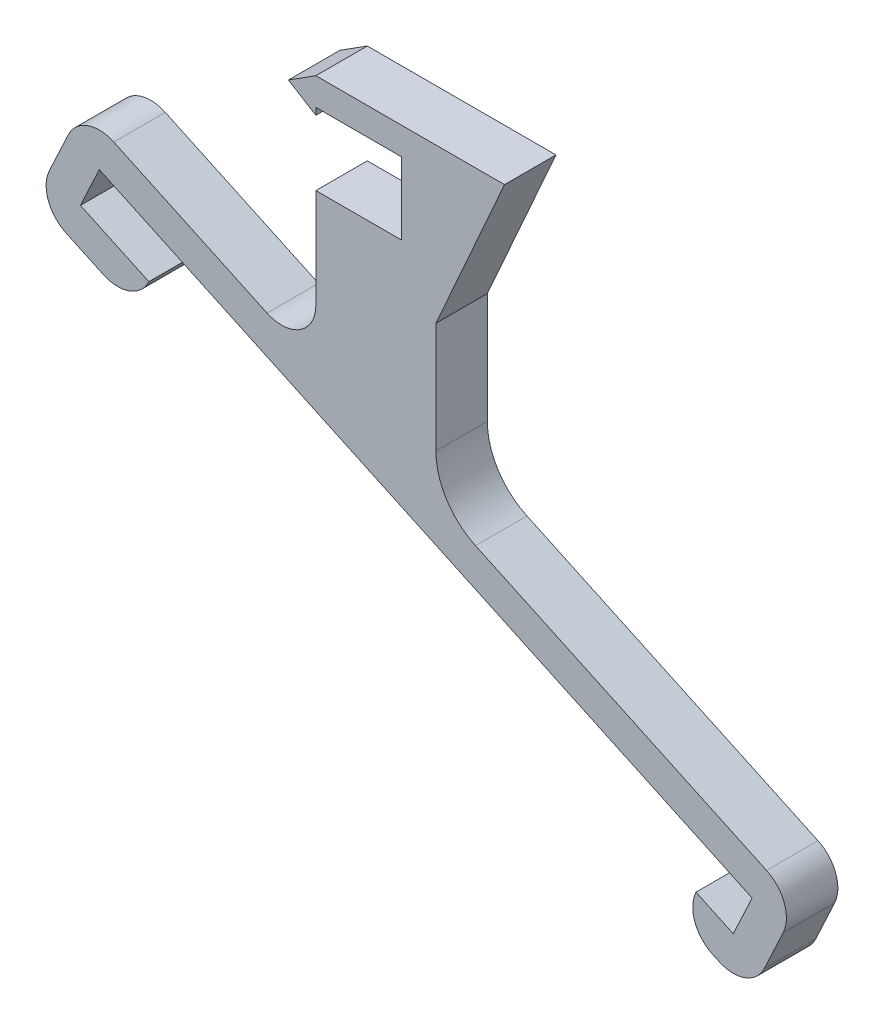
ISO-10303-21;
HEADER;
FILE_DESCRIPTION(('STEP AP214'),'2;1');
FILE_NAME('part.step','',(''),(''),'','','');
FILE_SCHEMA(('AUTOMOTIVE_DESIGN { 1 0 10303 214 1 1 1 1 }'));
ENDSEC;
DATA;
#1=APPLICATION_CONTEXT('core data for automotive mechanical design processes');
#2=APPLICATION_PROTOCOL_DEFINITION('international standard','automotive_design',2000,#1);
#3=PRODUCT_CONTEXT('',#1,'mechanical');
#4=PRODUCT('Part','Part','',(#3));
#5=PRODUCT_RELATED_PRODUCT_CATEGORY('part','',(#4));
#6=PRODUCT_DEFINITION_FORMATION('','',#4);
#7=PRODUCT_DEFINITION_CONTEXT('part definition',#1,'design');
#8=PRODUCT_DEFINITION('design','',#6,#7);
#9=PRODUCT_DEFINITION_SHAPE('','',#8);
#10=(LENGTH_UNIT() NAMED_UNIT(*) SI_UNIT(.MILLI.,.METRE.));
#11=(NAMED_UNIT(*) PLANE_ANGLE_UNIT() SI_UNIT($,.RADIAN.));
#12=(NAMED_UNIT(*) SI_UNIT($,.STERADIAN.) SOLID_ANGLE_UNIT());
#13=UNCERTAINTY_MEASURE_WITH_UNIT(LENGTH_MEASURE(1.E-05),#10,'distance_accuracy_value','');
#14=(GEOMETRIC_REPRESENTATION_CONTEXT(3) GLOBAL_UNCERTAINTY_ASSIGNED_CONTEXT((#13)) GLOBAL_UNIT_ASSIGNED_CONTEXT((#10,
#11,#12)) REPRESENTATION_CONTEXT('',''));
#15=CARTESIAN_POINT('',(0.,0.,0.));
#16=DIRECTION('',(0.,0.,1.));
#17=DIRECTION('',(1.,0.,0.));
#18=AXIS2_PLACEMENT_3D('',#15,#16,#17);
#19=CARTESIAN_POINT('',(0.,-21.,15.));
#20=DIRECTION('',(1.,0.,0.));
#21=DIRECTION('',(0.,0.,-1.));
#22=AXIS2_PLACEMENT_3D('',#19,#20,#21);
#23=PLANE('',#22);
#24=DIRECTION('',(0.,-1.,0.));
#25=VECTOR('',#24,1.);
#26=CARTESIAN_POINT('',(0.,-21.,0.));
#27=LINE('',#26,#25);
#28=CARTESIAN_POINT('',(0.,0.,0.));
#29=VERTEX_POINT('',#28);
#30=CARTESIAN_POINT('',(0.,-21.,0.));
#31=VERTEX_POINT('',#30);
#32=EDGE_CURVE('E253',#29,#31,#27,.T.);
#33=ORIENTED_EDGE('',*,*,#32,.T.);
#34=DIRECTION('',(0.,0.,-1.));
#35=VECTOR('',#34,1.);
#36=CARTESIAN_POINT('',(0.,-21.,15.));
#37=LINE('',#36,#35);
#38=CARTESIAN_POINT('',(0.,-21.,15.));
#39=VERTEX_POINT('',#38);
#40=EDGE_CURVE('E232',#39,#31,#37,.T.);
#41=ORIENTED_EDGE('',*,*,#40,.F.);
#42=DIRECTION('',(0.,-1.,0.));
#43=VECTOR('',#42,1.);
#44=CARTESIAN_POINT('',(0.,-21.,15.));
#45=LINE('',#44,#43);
#46=CARTESIAN_POINT('',(0.,0.,15.));
#47=VERTEX_POINT('',#46);
#48=EDGE_CURVE('E240',#47,#39,#45,.T.);
#49=ORIENTED_EDGE('',*,*,#48,.F.);
#50=DIRECTION('',(0.,0.,-1.));
#51=VECTOR('',#50,1.);
#52=CARTESIAN_POINT('',(0.,0.,15.));
#53=LINE('',#52,#51);
#54=EDGE_CURVE('E350',#47,#29,#53,.T.);
#55=ORIENTED_EDGE('',*,*,#54,.T.);
#56=EDGE_LOOP('',(#33,#41,#49,#55));
#57=FACE_BOUND('',#56,.T.);
#58=ADVANCED_FACE('F37',(#57),#23,.F.);
#59=CARTESIAN_POINT('',(-25.,-21.,15.));
#60=DIRECTION('',(0.,-1.,0.));
#61=DIRECTION('',(0.,0.,-1.));
#62=AXIS2_PLACEMENT_3D('',#59,#60,#61);
#63=PLANE('',#62);
#64=DIRECTION('',(-1.,0.,0.));
#65=VECTOR('',#64,1.);
#66=CARTESIAN_POINT('',(-25.,-21.,0.));
#67=LINE('',#66,#65);
#68=CARTESIAN_POINT('',(-25.,-21.,0.));
#69=VERTEX_POINT('',#68);
#70=EDGE_CURVE('E447',#31,#69,#67,.T.);
#71=ORIENTED_EDGE('',*,*,#70,.T.);
#72=DIRECTION('',(0.,0.,-1.));
#73=VECTOR('',#72,1.);
#74=CARTESIAN_POINT('',(-25.,-21.,15.));
#75=LINE('',#74,#73);
#76=CARTESIAN_POINT('',(-25.,-21.,15.));
#77=VERTEX_POINT('',#76);
#78=EDGE_CURVE('E235',#77,#69,#75,.T.);
#79=ORIENTED_EDGE('',*,*,#78,.F.);
#80=DIRECTION('',(-1.,0.,0.));
#81=VECTOR('',#80,1.);
#82=CARTESIAN_POINT('',(-25.,-21.,15.));
#83=LINE('',#82,#81);
#84=EDGE_CURVE('E228',#39,#77,#83,.T.);
#85=ORIENTED_EDGE('',*,*,#84,.F.);
#86=ORIENTED_EDGE('',*,*,#40,.T.);
#87=EDGE_LOOP('',(#71,#79,#85,#86));
#88=FACE_BOUND('',#87,.T.);
#89=ADVANCED_FACE('F230',(#88),#63,.F.);
#90=CARTESIAN_POINT('',(-25.,-65.6792319645748,15.));
#91=DIRECTION('',(1.,0.,0.));
#92=DIRECTION('',(0.,0.,-1.));
#93=AXIS2_PLACEMENT_3D('',#90,#91,#92);
#94=PLANE('',#93);
#95=DIRECTION('',(0.,-1.,0.));
#96=VECTOR('',#95,1.);
#97=CARTESIAN_POINT('',(-25.,-65.6792319645748,0.));
#98=LINE('',#97,#96);
#99=CARTESIAN_POINT('',(-25.,-49.9823761933999,0.));
#100=VERTEX_POINT('',#99);
#101=EDGE_CURVE('E449',#69,#100,#98,.T.);
#102=ORIENTED_EDGE('',*,*,#101,.T.);
#103=DIRECTION('',(0.,0.,-1.));
#104=VECTOR('',#103,1.);
#105=CARTESIAN_POINT('',(-25.,-49.9823761933999,15.));
#106=LINE('',#105,#104);
#107=CARTESIAN_POINT('',(-25.,-49.9823761933999,15.));
#108=VERTEX_POINT('',#107);
#109=EDGE_CURVE('E311',#100,#108,#106,.F.);
#110=ORIENTED_EDGE('',*,*,#109,.T.);
#111=DIRECTION('',(0.,-1.,0.));
#112=VECTOR('',#111,1.);
#113=CARTESIAN_POINT('',(-25.,-65.6792319645748,15.));
#114=LINE('',#113,#112);
#115=EDGE_CURVE('E239',#77,#108,#114,.T.);
#116=ORIENTED_EDGE('',*,*,#115,.F.);
#117=ORIENTED_EDGE('',*,*,#78,.T.);
#118=EDGE_LOOP('',(#102,#110,#116,#117));
#119=FACE_BOUND('',#118,.T.);
#120=ADVANCED_FACE('F532',(#119),#94,.F.);
#121=CARTESIAN_POINT('',(-92.9730840277486,-33.9828623340221,15.));
#122=DIRECTION('',(-0.422618261740704,-0.906307787036648,0.));
#123=DIRECTION('',(0.906307787036648,-0.422618261740704,0.));
#124=AXIS2_PLACEMENT_3D('',#121,#122,#123);
#125=PLANE('',#124);
#126=DIRECTION('',(-0.906307787036648,0.422618261740704,0.));
#127=VECTOR('',#126,1.);
#128=CARTESIAN_POINT('',(-92.9730840277486,-33.9828623340221,0.));
#129=LINE('',#128,#127);
#130=CARTESIAN_POINT('',(-39.226182617407,-59.0454540637663,0.));
#131=VERTEX_POINT('',#130);
#132=CARTESIAN_POINT('',(-83.9100061573821,-38.2090449514291,0.));
#133=VERTEX_POINT('',#132);
#134=EDGE_CURVE('E452',#131,#133,#129,.T.);
#135=ORIENTED_EDGE('',*,*,#134,.T.);
#136=DIRECTION('',(0.,0.,-1.));
#137=VECTOR('',#136,1.);
#138=CARTESIAN_POINT('',(-83.9100061573821,-38.2090449514291,15.));
#139=LINE('',#138,#137);
#140=CARTESIAN_POINT('',(-83.9100061573821,-38.2090449514291,15.));
#141=VERTEX_POINT('',#140);
#142=EDGE_CURVE('E309',#133,#141,#139,.F.);
#143=ORIENTED_EDGE('',*,*,#142,.T.);
#144=DIRECTION('',(-0.906307787036648,0.422618261740704,0.));
#145=VECTOR('',#144,1.);
#146=CARTESIAN_POINT('',(-92.9730840277486,-33.9828623340221,15.));
#147=LINE('',#146,#145);
#148=CARTESIAN_POINT('',(-39.226182617407,-59.0454540637663,15.));
#149=VERTEX_POINT('',#148);
#150=EDGE_CURVE('E476',#149,#141,#147,.T.);
#151=ORIENTED_EDGE('',*,*,#150,.F.);
#152=DIRECTION('',(0.,0.,-1.));
#153=VECTOR('',#152,1.);
#154=CARTESIAN_POINT('',(-39.226182617407,-59.0454540637663,0.));
#155=LINE('',#154,#153);
#156=EDGE_CURVE('E306',#149,#131,#155,.T.);
#157=ORIENTED_EDGE('',*,*,#156,.T.);
#158=EDGE_LOOP('',(#135,#143,#151,#157));
#159=FACE_BOUND('',#158,.T.);
#160=ADVANCED_FACE('F776',(#159),#125,.F.);
#161=CARTESIAN_POINT('',(-106.919486665192,-63.8910193062314,15.));
#162=DIRECTION('',(0.906307787036648,-0.422618261740703,0.));
#163=DIRECTION('',(0.422618261740703,0.906307787036648,0.));
#164=AXIS2_PLACEMENT_3D('',#161,#162,#163);
#165=PLANE('',#164);
#166=DIRECTION('',(-0.422618261740703,-0.906307787036648,0.));
#167=VECTOR('',#166,1.);
#168=CARTESIAN_POINT('',(-106.919486665192,-63.8910193062314,0.));
#169=LINE('',#168,#167);
#170=CARTESIAN_POINT('',(-97.1992666451556,-43.0459402043885,0.));
#171=VERTEX_POINT('',#170);
#172=CARTESIAN_POINT('',(-102.693304047785,-54.8279414358649,0.));
#173=VERTEX_POINT('',#172);
#174=EDGE_CURVE('E403',#171,#173,#169,.T.);
#175=ORIENTED_EDGE('',*,*,#174,.T.);
#176=DIRECTION('',(0.,0.,-1.));
#177=VECTOR('',#176,1.);
#178=CARTESIAN_POINT('',(-102.693304047785,-54.8279414358649,15.));
#179=LINE('',#178,#177);
#180=CARTESIAN_POINT('',(-102.693304047785,-54.8279414358649,15.));
#181=VERTEX_POINT('',#180);
#182=EDGE_CURVE('E304',#173,#181,#179,.F.);
#183=ORIENTED_EDGE('',*,*,#182,.T.);
#184=DIRECTION('',(-0.422618261740703,-0.906307787036648,0.));
#185=VECTOR('',#184,1.);
#186=CARTESIAN_POINT('',(-106.919486665192,-63.8910193062314,15.));
#187=LINE('',#186,#185);
#188=CARTESIAN_POINT('',(-97.1992666451556,-43.0459402043885,15.));
#189=VERTEX_POINT('',#188);
#190=EDGE_CURVE('E469',#189,#181,#187,.T.);
#191=ORIENTED_EDGE('',*,*,#190,.F.);
#192=DIRECTION('',(0.,0.,-1.));
#193=VECTOR('',#192,1.);
#194=CARTESIAN_POINT('',(-97.1992666451556,-43.0459402043885,15.));
#195=LINE('',#194,#193);
#196=EDGE_CURVE('E301',#189,#171,#195,.T.);
#197=ORIENTED_EDGE('',*,*,#196,.T.);
#198=EDGE_LOOP('',(#175,#183,#191,#197));
#199=FACE_BOUND('',#198,.T.);
#200=ADVANCED_FACE('F458',(#199),#165,.F.);
#201=CARTESIAN_POINT('',(-77.9176374800191,-77.4148036819339,15.));
#202=DIRECTION('',(0.422618261740703,0.906307787036648,0.));
#203=DIRECTION('',(-0.906307787036648,0.422618261740703,0.));
#204=AXIS2_PLACEMENT_3D('',#201,#202,#203);
#205=PLANE('',#204);
#206=DIRECTION('',(0.906307787036648,-0.422618261740703,0.));
#207=VECTOR('',#206,1.);
#208=CARTESIAN_POINT('',(-77.9176374800191,-77.4148036819339,0.));
#209=LINE('',#208,#207);
#210=CARTESIAN_POINT('',(-97.8564087948253,-68.1172019236385,0.));
#211=VERTEX_POINT('',#210);
#212=CARTESIAN_POINT('',(-86.9807153503855,-73.1886210645269,0.));
#213=VERTEX_POINT('',#212);
#214=EDGE_CURVE('E399',#211,#213,#209,.T.);
#215=ORIENTED_EDGE('',*,*,#214,.T.);
#216=DIRECTION('',(0.,0.,-1.));
#217=VECTOR('',#216,1.);
#218=CARTESIAN_POINT('',(-86.9807153503855,-73.1886210645269,15.));
#219=LINE('',#218,#217);
#220=CARTESIAN_POINT('',(-86.9807153503855,-73.1886210645269,15.));
#221=VERTEX_POINT('',#220);
#222=EDGE_CURVE('E299',#213,#221,#219,.F.);
#223=ORIENTED_EDGE('',*,*,#222,.T.);
#224=DIRECTION('',(0.906307787036648,-0.422618261740703,0.));
#225=VECTOR('',#224,1.);
#226=CARTESIAN_POINT('',(-77.9176374800191,-77.4148036819339,15.));
#227=LINE('',#226,#225);
#228=CARTESIAN_POINT('',(-97.8564087948253,-68.1172019236385,15.));
#229=VERTEX_POINT('',#228);
#230=EDGE_CURVE('E468',#229,#221,#227,.T.);
#231=ORIENTED_EDGE('',*,*,#230,.F.);
#232=DIRECTION('',(0.,0.,-1.));
#233=VECTOR('',#232,1.);
#234=CARTESIAN_POINT('',(-97.8564087948253,-68.1172019236385,15.));
#235=LINE('',#234,#233);
#236=EDGE_CURVE('E296',#229,#211,#235,.T.);
#237=ORIENTED_EDGE('',*,*,#236,.T.);
#238=EDGE_LOOP('',(#215,#223,#231,#237));
#239=FACE_BOUND('',#238,.T.);
#240=ADVANCED_FACE('F471',(#239),#205,.F.);
#241=CARTESIAN_POINT('',(-93.6302261774183,-59.0541240532721,15.));
#242=DIRECTION('',(-0.422618261740703,-0.906307787036648,0.));
#243=DIRECTION('',(0.906307787036648,-0.422618261740703,0.));
#244=AXIS2_PLACEMENT_3D('',#241,#242,#243);
#245=PLANE('',#244);
#246=DIRECTION('',(-0.906307787036648,0.422618261740703,0.));
#247=VECTOR('',#246,1.);
#248=CARTESIAN_POINT('',(-93.6302261774183,-59.0541240532721,0.));
#249=LINE('',#248,#247);
#250=CARTESIAN_POINT('',(-73.691454862612,-68.3517258115675,0.));
#251=VERTEX_POINT('',#250);
#252=CARTESIAN_POINT('',(-93.6302261774183,-59.0541240532721,0.));
#253=VERTEX_POINT('',#252);
#254=EDGE_CURVE('E390',#251,#253,#249,.T.);
#255=ORIENTED_EDGE('',*,*,#254,.T.);
#256=DIRECTION('',(0.,0.,-1.));
#257=VECTOR('',#256,1.);
#258=CARTESIAN_POINT('',(-93.6302261774183,-59.0541240532721,15.));
#259=LINE('',#258,#257);
#260=CARTESIAN_POINT('',(-93.6302261774183,-59.0541240532721,15.));
#261=VERTEX_POINT('',#260);
#262=EDGE_CURVE('E381',#261,#253,#259,.T.);
#263=ORIENTED_EDGE('',*,*,#262,.F.);
#264=DIRECTION('',(-0.906307787036648,0.422618261740703,0.));
#265=VECTOR('',#264,1.);
#266=CARTESIAN_POINT('',(-93.6302261774183,-59.0541240532721,15.));
#267=LINE('',#266,#265);
#268=CARTESIAN_POINT('',(-73.691454862612,-68.3517258115675,15.));
#269=VERTEX_POINT('',#268);
#270=EDGE_CURVE('E391',#269,#261,#267,.T.);
#271=ORIENTED_EDGE('',*,*,#270,.F.);
#272=DIRECTION('',(0.,0.,-1.));
#273=VECTOR('',#272,1.);
#274=CARTESIAN_POINT('',(-73.691454862612,-68.3517258115675,15.));
#275=LINE('',#274,#273);
#276=EDGE_CURVE('E259',#269,#251,#275,.T.);
#277=ORIENTED_EDGE('',*,*,#276,.T.);
#278=EDGE_LOOP('',(#255,#263,#271,#277));
#279=FACE_BOUND('',#278,.T.);
#280=ADVANCED_FACE('F388',(#279),#245,.F.);
#281=CARTESIAN_POINT('',(-88.1361887747892,-47.2721228217957,15.));
#282=DIRECTION('',(-0.906307787036648,0.422618261740705,0.));
#283=DIRECTION('',(-0.422618261740705,-0.906307787036648,0.));
#284=AXIS2_PLACEMENT_3D('',#281,#282,#283);
#285=PLANE('',#284);
#286=DIRECTION('',(0.422618261740705,0.906307787036647,0.));
#287=VECTOR('',#286,1.);
#288=CARTESIAN_POINT('',(-88.1361887747892,-47.2721228217957,0.));
#289=LINE('',#288,#287);
#290=CARTESIAN_POINT('',(-88.1361887747892,-47.2721228217957,0.));
#291=VERTEX_POINT('',#290);
#292=EDGE_CURVE('E398',#253,#291,#289,.T.);
#293=ORIENTED_EDGE('',*,*,#292,.T.);
#294=DIRECTION('',(0.,0.,-1.));
#295=VECTOR('',#294,1.);
#296=CARTESIAN_POINT('',(-88.1361887747892,-47.2721228217957,15.));
#297=LINE('',#296,#295);
#298=CARTESIAN_POINT('',(-88.1361887747892,-47.2721228217957,15.));
#299=VERTEX_POINT('',#298);
#300=EDGE_CURVE('E378',#299,#291,#297,.T.);
#301=ORIENTED_EDGE('',*,*,#300,.F.);
#302=DIRECTION('',(0.422618261740705,0.906307787036647,0.));
#303=VECTOR('',#302,1.);
#304=CARTESIAN_POINT('',(-88.1361887747892,-47.2721228217957,15.));
#305=LINE('',#304,#303);
#306=EDGE_CURVE('E474',#261,#299,#305,.T.);
#307=ORIENTED_EDGE('',*,*,#306,.F.);
#308=ORIENTED_EDGE('',*,*,#262,.T.);
#309=EDGE_LOOP('',(#293,#301,#307,#308));
#310=FACE_BOUND('',#309,.T.);
#311=ADVANCED_FACE('F516',(#310),#285,.F.);
#312=CARTESIAN_POINT('',(102.188446502907,-136.021957787343,15.));
#313=DIRECTION('',(0.422618261740703,0.906307787036648,0.));
#314=DIRECTION('',(-0.906307787036648,0.422618261740703,0.));
#315=AXIS2_PLACEMENT_3D('',#312,#313,#314);
#316=PLANE('',#315);
#317=DIRECTION('',(0.906307787036648,-0.422618261740703,0.));
#318=VECTOR('',#317,1.);
#319=CARTESIAN_POINT('',(102.188446502907,-136.021957787343,0.));
#320=LINE('',#319,#318);
#321=CARTESIAN_POINT('',(102.188446502907,-136.021957787343,0.));
#322=VERTEX_POINT('',#321);
#323=EDGE_CURVE('E401',#291,#322,#320,.T.);
#324=ORIENTED_EDGE('',*,*,#323,.T.);
#325=DIRECTION('',(0.,0.,-1.));
#326=VECTOR('',#325,1.);
#327=CARTESIAN_POINT('',(102.188446502907,-136.021957787343,15.));
#328=LINE('',#327,#326);
#329=CARTESIAN_POINT('',(102.188446502907,-136.021957787343,15.));
#330=VERTEX_POINT('',#329);
#331=EDGE_CURVE('E375',#330,#322,#328,.T.);
#332=ORIENTED_EDGE('',*,*,#331,.F.);
#333=DIRECTION('',(0.906307787036648,-0.422618261740703,0.));
#334=VECTOR('',#333,1.);
#335=CARTESIAN_POINT('',(102.188446502907,-136.021957787343,15.));
#336=LINE('',#335,#334);
#337=EDGE_CURVE('E481',#299,#330,#336,.T.);
#338=ORIENTED_EDGE('',*,*,#337,.F.);
#339=ORIENTED_EDGE('',*,*,#300,.T.);
#340=EDGE_LOOP('',(#324,#332,#338,#339));
#341=FACE_BOUND('',#340,.T.);
#342=ADVANCED_FACE('F511',(#341),#316,.F.);
#343=CARTESIAN_POINT('',(96.6944091002778,-147.80395901882,15.));
#344=DIRECTION('',(0.906307787036648,-0.422618261740704,0.));
#345=DIRECTION('',(0.422618261740704,0.906307787036648,0.));
#346=AXIS2_PLACEMENT_3D('',#343,#344,#345);
#347=PLANE('',#346);
#348=DIRECTION('',(-0.422618261740704,-0.906307787036648,0.));
#349=VECTOR('',#348,1.);
#350=CARTESIAN_POINT('',(96.6944091002778,-147.80395901882,0.));
#351=LINE('',#350,#349);
#352=CARTESIAN_POINT('',(96.6944091002778,-147.80395901882,0.));
#353=VERTEX_POINT('',#352);
#354=EDGE_CURVE('E408',#322,#353,#351,.T.);
#355=ORIENTED_EDGE('',*,*,#354,.T.);
#356=DIRECTION('',(0.,0.,-1.));
#357=VECTOR('',#356,1.);
#358=CARTESIAN_POINT('',(96.6944091002778,-147.80395901882,15.));
#359=LINE('',#358,#357);
#360=CARTESIAN_POINT('',(96.6944091002778,-147.80395901882,15.));
#361=VERTEX_POINT('',#360);
#362=EDGE_CURVE('E372',#361,#353,#359,.T.);
#363=ORIENTED_EDGE('',*,*,#362,.F.);
#364=DIRECTION('',(-0.422618261740704,-0.906307787036648,0.));
#365=VECTOR('',#364,1.);
#366=CARTESIAN_POINT('',(96.6944091002778,-147.80395901882,15.));
#367=LINE('',#366,#365);
#368=EDGE_CURVE('E483',#330,#361,#367,.T.);
#369=ORIENTED_EDGE('',*,*,#368,.F.);
#370=ORIENTED_EDGE('',*,*,#331,.T.);
#371=EDGE_LOOP('',(#355,#363,#369,#370));
#372=FACE_BOUND('',#371,.T.);
#373=ADVANCED_FACE('F508',(#372),#347,.F.);
#374=CARTESIAN_POINT('',(85.8187156558381,-142.732539877931,15.));
#375=DIRECTION('',(-0.422618261740719,-0.906307787036641,0.));
#376=DIRECTION('',(0.906307787036641,-0.422618261740719,0.));
#377=AXIS2_PLACEMENT_3D('',#374,#375,#376);
#378=PLANE('',#377);
#379=DIRECTION('',(-0.906307787036641,0.422618261740719,0.));
#380=VECTOR('',#379,1.);
#381=CARTESIAN_POINT('',(85.8187156558381,-142.732539877931,0.));
#382=LINE('',#381,#380);
#383=CARTESIAN_POINT('',(85.8187156558381,-142.732539877931,0.));
#384=VERTEX_POINT('',#383);
#385=EDGE_CURVE('E410',#353,#384,#382,.T.);
#386=ORIENTED_EDGE('',*,*,#385,.T.);
#387=DIRECTION('',(0.,0.,-1.));
#388=VECTOR('',#387,1.);
#389=CARTESIAN_POINT('',(85.8187156558381,-142.732539877931,15.));
#390=LINE('',#389,#388);
#391=CARTESIAN_POINT('',(85.8187156558381,-142.732539877931,15.));
#392=VERTEX_POINT('',#391);
#393=EDGE_CURVE('E369',#392,#384,#390,.T.);
#394=ORIENTED_EDGE('',*,*,#393,.F.);
#395=DIRECTION('',(-0.906307787036641,0.422618261740719,0.));
#396=VECTOR('',#395,1.);
#397=CARTESIAN_POINT('',(85.8187156558381,-142.732539877931,15.));
#398=LINE('',#397,#396);
#399=EDGE_CURVE('E485',#361,#392,#398,.T.);
#400=ORIENTED_EDGE('',*,*,#399,.F.);
#401=ORIENTED_EDGE('',*,*,#362,.T.);
#402=EDGE_LOOP('',(#386,#394,#400,#401));
#403=FACE_BOUND('',#402,.T.);
#404=ADVANCED_FACE('F503',(#403),#378,.F.);
#405=CARTESIAN_POINT('',(101.531304353237,-161.093219506593,15.));
#406=DIRECTION('',(0.422618261740702,0.906307787036649,0.));
#407=DIRECTION('',(-0.906307787036649,0.422618261740702,0.));
#408=AXIS2_PLACEMENT_3D('',#405,#406,#407);
#409=PLANE('',#408);
#410=DIRECTION('',(0.906307787036649,-0.422618261740702,0.));
#411=VECTOR('',#410,1.);
#412=CARTESIAN_POINT('',(101.531304353237,-161.093219506593,0.));
#413=LINE('',#412,#411);
#414=CARTESIAN_POINT('',(90.6556109087975,-156.021800365705,0.));
#415=VERTEX_POINT('',#414);
#416=CARTESIAN_POINT('',(92.4682264828708,-156.867036889186,0.));
#417=VERTEX_POINT('',#416);
#418=EDGE_CURVE('E413',#415,#417,#413,.T.);
#419=ORIENTED_EDGE('',*,*,#418,.T.);
#420=DIRECTION('',(0.,0.,-1.));
#421=VECTOR('',#420,1.);
#422=CARTESIAN_POINT('',(92.4682264828708,-156.867036889186,15.));
#423=LINE('',#422,#421);
#424=CARTESIAN_POINT('',(92.4682264828708,-156.867036889186,15.));
#425=VERTEX_POINT('',#424);
#426=EDGE_CURVE('E294',#417,#425,#423,.F.);
#427=ORIENTED_EDGE('',*,*,#426,.T.);
#428=DIRECTION('',(0.906307787036649,-0.422618261740702,0.));
#429=VECTOR('',#428,1.);
#430=CARTESIAN_POINT('',(101.531304353237,-161.093219506593,15.));
#431=LINE('',#430,#429);
#432=CARTESIAN_POINT('',(90.6556109087975,-156.021800365705,15.));
#433=VERTEX_POINT('',#432);
#434=EDGE_CURVE('E432',#433,#425,#431,.T.);
#435=ORIENTED_EDGE('',*,*,#434,.F.);
#436=DIRECTION('',(0.,0.,-1.));
#437=VECTOR('',#436,1.);
#438=CARTESIAN_POINT('',(90.6556109087975,-156.021800365705,15.));
#439=LINE('',#438,#437);
#440=EDGE_CURVE('E291',#433,#415,#439,.T.);
#441=ORIENTED_EDGE('',*,*,#440,.T.);
#442=EDGE_LOOP('',(#419,#427,#435,#441));
#443=FACE_BOUND('',#442,.T.);
#444=ADVANCED_FACE('F496',(#443),#409,.F.);
#445=CARTESIAN_POINT('',(115.47770699068,-131.185062534384,15.));
#446=DIRECTION('',(-0.906307787036648,0.422618261740703,0.));
#447=DIRECTION('',(-0.422618261740703,-0.906307787036648,0.));
#448=AXIS2_PLACEMENT_3D('',#445,#446,#447);
#449=PLANE('',#448);
#450=DIRECTION('',(0.422618261740703,0.906307787036648,0.));
#451=VECTOR('',#450,1.);
#452=CARTESIAN_POINT('',(115.47770699068,-131.185062534384,0.));
#453=LINE('',#452,#451);
#454=CARTESIAN_POINT('',(105.757486970644,-152.030141636227,0.));
#455=VERTEX_POINT('',#454);
#456=CARTESIAN_POINT('',(111.251524373273,-140.24814040475,0.));
#457=VERTEX_POINT('',#456);
#458=EDGE_CURVE('E338',#455,#457,#453,.T.);
#459=ORIENTED_EDGE('',*,*,#458,.T.);
#460=DIRECTION('',(0.,0.,-1.));
#461=VECTOR('',#460,1.);
#462=CARTESIAN_POINT('',(111.251524373273,-140.24814040475,15.));
#463=LINE('',#462,#461);
#464=CARTESIAN_POINT('',(111.251524373273,-140.24814040475,15.));
#465=VERTEX_POINT('',#464);
#466=EDGE_CURVE('E277',#457,#465,#463,.F.);
#467=ORIENTED_EDGE('',*,*,#466,.T.);
#468=DIRECTION('',(0.422618261740703,0.906307787036648,0.));
#469=VECTOR('',#468,1.);
#470=CARTESIAN_POINT('',(115.47770699068,-131.185062534384,15.));
#471=LINE('',#470,#469);
#472=CARTESIAN_POINT('',(105.757486970644,-152.030141636227,15.));
#473=VERTEX_POINT('',#472);
#474=EDGE_CURVE('E427',#473,#465,#471,.T.);
#475=ORIENTED_EDGE('',*,*,#474,.F.);
#476=DIRECTION('',(0.,0.,-1.));
#477=VECTOR('',#476,1.);
#478=CARTESIAN_POINT('',(105.757486970644,-152.030141636227,15.));
#479=LINE('',#478,#477);
#480=EDGE_CURVE('E274',#473,#455,#479,.T.);
#481=ORIENTED_EDGE('',*,*,#480,.T.);
#482=EDGE_LOOP('',(#459,#467,#475,#481));
#483=FACE_BOUND('',#482,.T.);
#484=ADVANCED_FACE('F419',(#483),#449,.F.);
#485=CARTESIAN_POINT('',(10.,-82.,15.));
#486=DIRECTION('',(-0.422618261740704,-0.906307787036648,0.));
#487=DIRECTION('',(0.906307787036648,-0.422618261740704,0.));
#488=AXIS2_PLACEMENT_3D('',#485,#486,#487);
#489=PLANE('',#488);
#490=DIRECTION('',(-0.906307787036648,0.422618261740704,0.));
#491=VECTOR('',#490,1.);
#492=CARTESIAN_POINT('',(10.,-82.,0.));
#493=LINE('',#492,#491);
#494=CARTESIAN_POINT('',(106.414629120314,-126.958879916977,0.));
#495=VERTEX_POINT('',#494);
#496=CARTESIAN_POINT('',(21.5476347651859,-87.3847505245832,0.));
#497=VERTEX_POINT('',#496);
#498=EDGE_CURVE('E334',#495,#497,#493,.T.);
#499=ORIENTED_EDGE('',*,*,#498,.T.);
#500=DIRECTION('',(0.,0.,-1.));
#501=VECTOR('',#500,1.);
#502=CARTESIAN_POINT('',(21.5476347651859,-87.3847505245832,15.));
#503=LINE('',#502,#501);
#504=CARTESIAN_POINT('',(21.5476347651859,-87.3847505245832,15.));
#505=VERTEX_POINT('',#504);
#506=EDGE_CURVE('E58',#497,#505,#503,.F.);
#507=ORIENTED_EDGE('',*,*,#506,.T.);
#508=DIRECTION('',(-0.906307787036648,0.422618261740704,0.));
#509=VECTOR('',#508,1.);
#510=CARTESIAN_POINT('',(10.,-82.,15.));
#511=LINE('',#510,#509);
#512=CARTESIAN_POINT('',(106.414629120314,-126.958879916977,15.));
#513=VERTEX_POINT('',#512);
#514=EDGE_CURVE('E426',#513,#505,#511,.T.);
#515=ORIENTED_EDGE('',*,*,#514,.F.);
#516=DIRECTION('',(0.,0.,-1.));
#517=VECTOR('',#516,1.);
#518=CARTESIAN_POINT('',(106.414629120314,-126.958879916977,15.));
#519=LINE('',#518,#517);
#520=EDGE_CURVE('E254',#513,#495,#519,.T.);
#521=ORIENTED_EDGE('',*,*,#520,.T.);
#522=EDGE_LOOP('',(#499,#507,#515,#521));
#523=FACE_BOUND('',#522,.T.);
#524=ADVANCED_FACE('F428',(#523),#489,.F.);
#525=CARTESIAN_POINT('',(10.,-37.,15.));
#526=DIRECTION('',(-1.,0.,0.));
#527=DIRECTION('',(0.,-1.,0.));
#528=AXIS2_PLACEMENT_3D('',#525,#526,#527);
#529=PLANE('',#528);
#530=DIRECTION('',(0.,1.,0.));
#531=VECTOR('',#530,1.);
#532=CARTESIAN_POINT('',(10.,-37.,15.));
#533=LINE('',#532,#531);
#534=CARTESIAN_POINT('',(10.,-69.2585947838502,15.));
#535=VERTEX_POINT('',#534);
#536=CARTESIAN_POINT('',(10.,-37.,15.));
#537=VERTEX_POINT('',#536);
#538=EDGE_CURVE('E327',#535,#537,#533,.T.);
#539=ORIENTED_EDGE('',*,*,#538,.F.);
#540=DIRECTION('',(0.,0.,-1.));
#541=VECTOR('',#540,1.);
#542=CARTESIAN_POINT('',(10.,-69.2585947838502,0.));
#543=LINE('',#542,#541);
#544=CARTESIAN_POINT('',(10.,-69.2585947838502,0.));
#545=VERTEX_POINT('',#544);
#546=EDGE_CURVE('E317',#535,#545,#543,.T.);
#547=ORIENTED_EDGE('',*,*,#546,.T.);
#548=DIRECTION('',(0.,1.,0.));
#549=VECTOR('',#548,1.);
#550=CARTESIAN_POINT('',(10.,-37.,0.));
#551=LINE('',#550,#549);
#552=CARTESIAN_POINT('',(10.,-37.,0.));
#553=VERTEX_POINT('',#552);
#554=EDGE_CURVE('E325',#545,#553,#551,.T.);
#555=ORIENTED_EDGE('',*,*,#554,.T.);
#556=DIRECTION('',(0.,0.,-1.));
#557=VECTOR('',#556,1.);
#558=CARTESIAN_POINT('',(10.,-37.,15.));
#559=LINE('',#558,#557);
#560=EDGE_CURVE('E367',#537,#553,#559,.T.);
#561=ORIENTED_EDGE('',*,*,#560,.F.);
#562=EDGE_LOOP('',(#539,#547,#555,#561));
#563=FACE_BOUND('',#562,.T.);
#564=ADVANCED_FACE('F323',(#563),#529,.F.);
#565=CARTESIAN_POINT('',(30.,8.,15.));
#566=DIRECTION('',(-0.913811548620257,0.406138466053448,0.));
#567=DIRECTION('',(-0.406138466053448,-0.913811548620257,0.));
#568=AXIS2_PLACEMENT_3D('',#565,#566,#567);
#569=PLANE('',#568);
#570=DIRECTION('',(0.406138466053448,0.913811548620257,0.));
#571=VECTOR('',#570,1.);
#572=CARTESIAN_POINT('',(30.,8.,0.));
#573=LINE('',#572,#571);
#574=CARTESIAN_POINT('',(30.,8.,0.));
#575=VERTEX_POINT('',#574);
#576=EDGE_CURVE('E333',#553,#575,#573,.T.);
#577=ORIENTED_EDGE('',*,*,#576,.T.);
#578=DIRECTION('',(0.,0.,-1.));
#579=VECTOR('',#578,1.);
#580=CARTESIAN_POINT('',(30.,8.,15.));
#581=LINE('',#580,#579);
#582=CARTESIAN_POINT('',(30.,8.,15.));
#583=VERTEX_POINT('',#582);
#584=EDGE_CURVE('E364',#583,#575,#581,.T.);
#585=ORIENTED_EDGE('',*,*,#584,.F.);
#586=DIRECTION('',(0.406138466053448,0.913811548620257,0.));
#587=VECTOR('',#586,1.);
#588=CARTESIAN_POINT('',(30.,8.,15.));
#589=LINE('',#588,#587);
#590=EDGE_CURVE('E430',#537,#583,#589,.T.);
#591=ORIENTED_EDGE('',*,*,#590,.F.);
#592=ORIENTED_EDGE('',*,*,#560,.T.);
#593=EDGE_LOOP('',(#577,#585,#591,#592));
#594=FACE_BOUND('',#593,.T.);
#595=ADVANCED_FACE('F603',(#594),#569,.F.);
#596=CARTESIAN_POINT('',(-25.,8.,15.));
#597=DIRECTION('',(0.,-1.,0.));
#598=DIRECTION('',(0.,0.,-1.));
#599=AXIS2_PLACEMENT_3D('',#596,#597,#598);
#600=PLANE('',#599);
#601=DIRECTION('',(-1.,0.,0.));
#602=VECTOR('',#601,1.);
#603=CARTESIAN_POINT('',(-25.,8.,0.));
#604=LINE('',#603,#602);
#605=CARTESIAN_POINT('',(-25.,8.,0.));
#606=VERTEX_POINT('',#605);
#607=EDGE_CURVE('E336',#575,#606,#604,.T.);
#608=ORIENTED_EDGE('',*,*,#607,.T.);
#609=DIRECTION('',(0.,0.,-1.));
#610=VECTOR('',#609,1.);
#611=CARTESIAN_POINT('',(-25.,8.,15.));
#612=LINE('',#611,#610);
#613=CARTESIAN_POINT('',(-25.,8.,15.));
#614=VERTEX_POINT('',#613);
#615=EDGE_CURVE('E361',#614,#606,#612,.T.);
#616=ORIENTED_EDGE('',*,*,#615,.F.);
#617=DIRECTION('',(-1.,0.,0.));
#618=VECTOR('',#617,1.);
#619=CARTESIAN_POINT('',(10.,8.,15.));
#620=LINE('',#619,#618);
#621=EDGE_CURVE('E437',#583,#614,#620,.T.);
#622=ORIENTED_EDGE('',*,*,#621,.F.);
#623=ORIENTED_EDGE('',*,*,#584,.T.);
#624=EDGE_LOOP('',(#608,#616,#622,#623));
#625=FACE_BOUND('',#624,.T.);
#626=ADVANCED_FACE('F686',(#625),#600,.F.);
#627=CARTESIAN_POINT('',(-33.,2.9140010844561,15.));
#628=DIRECTION('',(0.536506775517221,-0.843896012447099,0.));
#629=DIRECTION('',(0.843896012447099,0.536506775517221,0.));
#630=AXIS2_PLACEMENT_3D('',#627,#628,#629);
#631=PLANE('',#630);
#632=DIRECTION('',(-0.843896012447099,-0.536506775517221,0.));
#633=VECTOR('',#632,1.);
#634=CARTESIAN_POINT('',(-33.,2.9140010844561,0.));
#635=LINE('',#634,#633);
#636=CARTESIAN_POINT('',(-33.,2.9140010844561,0.));
#637=VERTEX_POINT('',#636);
#638=EDGE_CURVE('E343',#606,#637,#635,.T.);
#639=ORIENTED_EDGE('',*,*,#638,.T.);
#640=DIRECTION('',(0.,0.,-1.));
#641=VECTOR('',#640,1.);
#642=CARTESIAN_POINT('',(-33.,2.9140010844561,15.));
#643=LINE('',#642,#641);
#644=CARTESIAN_POINT('',(-33.,2.9140010844561,15.));
#645=VERTEX_POINT('',#644);
#646=EDGE_CURVE('E358',#645,#637,#643,.T.);
#647=ORIENTED_EDGE('',*,*,#646,.F.);
#648=DIRECTION('',(-0.843896012447099,-0.536506775517221,0.));
#649=VECTOR('',#648,1.);
#650=CARTESIAN_POINT('',(-33.,2.9140010844561,15.));
#651=LINE('',#650,#649);
#652=EDGE_CURVE('E439',#614,#645,#651,.T.);
#653=ORIENTED_EDGE('',*,*,#652,.F.);
#654=ORIENTED_EDGE('',*,*,#615,.T.);
#655=EDGE_LOOP('',(#639,#647,#653,#654));
#656=FACE_BOUND('',#655,.T.);
#657=ADVANCED_FACE('F676',(#656),#631,.F.);
#658=CARTESIAN_POINT('',(-25.,-2.,15.));
#659=DIRECTION('',(0.523396095079212,0.852089506833544,0.));
#660=DIRECTION('',(-0.852089506833544,0.523396095079212,0.));
#661=AXIS2_PLACEMENT_3D('',#658,#659,#660);
#662=PLANE('',#661);
#663=DIRECTION('',(0.852089506833544,-0.523396095079212,0.));
#664=VECTOR('',#663,1.);
#665=CARTESIAN_POINT('',(-25.,-2.,0.));
#666=LINE('',#665,#664);
#667=CARTESIAN_POINT('',(-25.,-2.,0.));
#668=VERTEX_POINT('',#667);
#669=EDGE_CURVE('E345',#637,#668,#666,.T.);
#670=ORIENTED_EDGE('',*,*,#669,.T.);
#671=DIRECTION('',(0.,0.,-1.));
#672=VECTOR('',#671,1.);
#673=CARTESIAN_POINT('',(-25.,-2.,15.));
#674=LINE('',#673,#672);
#675=CARTESIAN_POINT('',(-25.,-2.,15.));
#676=VERTEX_POINT('',#675);
#677=EDGE_CURVE('E355',#676,#668,#674,.T.);
#678=ORIENTED_EDGE('',*,*,#677,.F.);
#679=DIRECTION('',(0.852089506833544,-0.523396095079212,0.));
#680=VECTOR('',#679,1.);
#681=CARTESIAN_POINT('',(-25.,-2.,15.));
#682=LINE('',#681,#680);
#683=EDGE_CURVE('E441',#645,#676,#682,.T.);
#684=ORIENTED_EDGE('',*,*,#683,.F.);
#685=ORIENTED_EDGE('',*,*,#646,.T.);
#686=EDGE_LOOP('',(#670,#678,#684,#685));
#687=FACE_BOUND('',#686,.T.);
#688=ADVANCED_FACE('F666',(#687),#662,.F.);
#689=CARTESIAN_POINT('',(-25.,0.,15.));
#690=DIRECTION('',(-1.,0.,0.));
#691=DIRECTION('',(0.,0.,1.));
#692=AXIS2_PLACEMENT_3D('',#689,#690,#691);
#693=PLANE('',#692);
#694=DIRECTION('',(0.,1.,0.));
#695=VECTOR('',#694,1.);
#696=CARTESIAN_POINT('',(-25.,0.,0.));
#697=LINE('',#696,#695);
#698=CARTESIAN_POINT('',(-25.,0.,0.));
#699=VERTEX_POINT('',#698);
#700=EDGE_CURVE('E347',#668,#699,#697,.T.);
#701=ORIENTED_EDGE('',*,*,#700,.T.);
#702=DIRECTION('',(0.,0.,-1.));
#703=VECTOR('',#702,1.);
#704=CARTESIAN_POINT('',(-25.,0.,15.));
#705=LINE('',#704,#703);
#706=CARTESIAN_POINT('',(-25.,0.,15.));
#707=VERTEX_POINT('',#706);
#708=EDGE_CURVE('E352',#707,#699,#705,.T.);
#709=ORIENTED_EDGE('',*,*,#708,.F.);
#710=DIRECTION('',(0.,1.,0.));
#711=VECTOR('',#710,1.);
#712=CARTESIAN_POINT('',(-25.,0.,15.));
#713=LINE('',#712,#711);
#714=EDGE_CURVE('E443',#676,#707,#713,.T.);
#715=ORIENTED_EDGE('',*,*,#714,.F.);
#716=ORIENTED_EDGE('',*,*,#677,.T.);
#717=EDGE_LOOP('',(#701,#709,#715,#716));
#718=FACE_BOUND('',#717,.T.);
#719=ADVANCED_FACE('F656',(#718),#693,.F.);
#720=CARTESIAN_POINT('',(0.,0.,15.));
#721=DIRECTION('',(0.,1.,0.));
#722=DIRECTION('',(0.,0.,1.));
#723=AXIS2_PLACEMENT_3D('',#720,#721,#722);
#724=PLANE('',#723);
#725=DIRECTION('',(1.,0.,0.));
#726=VECTOR('',#725,1.);
#727=CARTESIAN_POINT('',(0.,0.,0.));
#728=LINE('',#727,#726);
#729=EDGE_CURVE('E250',#699,#29,#728,.T.);
#730=ORIENTED_EDGE('',*,*,#729,.T.);
#731=ORIENTED_EDGE('',*,*,#54,.F.);
#732=DIRECTION('',(1.,0.,0.));
#733=VECTOR('',#732,1.);
#734=CARTESIAN_POINT('',(0.,0.,15.));
#735=LINE('',#734,#733);
#736=EDGE_CURVE('E246',#707,#47,#735,.T.);
#737=ORIENTED_EDGE('',*,*,#736,.F.);
#738=ORIENTED_EDGE('',*,*,#708,.T.);
#739=EDGE_LOOP('',(#730,#731,#737,#738));
#740=FACE_BOUND('',#739,.T.);
#741=ADVANCED_FACE('F615',(#740),#724,.F.);
#742=CARTESIAN_POINT('',(0.,0.,15.));
#743=DIRECTION('',(0.,0.,1.));
#744=DIRECTION('',(1.,0.,0.));
#745=AXIS2_PLACEMENT_3D('',#742,#743,#744);
#746=PLANE('',#745);
#747=ORIENTED_EDGE('',*,*,#474,.T.);
#748=CARTESIAN_POINT('',(102.188446502907,-136.021957787343,15.));
#749=DIRECTION('',(0.,0.,1.));
#750=DIRECTION('',(1.,0.,0.));
#751=AXIS2_PLACEMENT_3D('',#748,#749,#750);
#752=CIRCLE('',#751,10.);
#753=EDGE_CURVE('E289',#465,#513,#752,.T.);
#754=ORIENTED_EDGE('',*,*,#753,.T.);
#755=ORIENTED_EDGE('',*,*,#514,.T.);
#756=CARTESIAN_POINT('',(30.,-69.2585947838502,15.));
#757=DIRECTION('',(0.,0.,1.));
#758=DIRECTION('',(1.,0.,0.));
#759=AXIS2_PLACEMENT_3D('',#756,#757,#758);
#760=CIRCLE('',#759,20.);
#761=EDGE_CURVE('E11',#505,#535,#760,.F.);
#762=ORIENTED_EDGE('',*,*,#761,.T.);
#763=ORIENTED_EDGE('',*,*,#538,.T.);
#764=ORIENTED_EDGE('',*,*,#590,.T.);
#765=ORIENTED_EDGE('',*,*,#621,.T.);
#766=ORIENTED_EDGE('',*,*,#652,.T.);
#767=ORIENTED_EDGE('',*,*,#683,.T.);
#768=ORIENTED_EDGE('',*,*,#714,.T.);
#769=ORIENTED_EDGE('',*,*,#736,.T.);
#770=ORIENTED_EDGE('',*,*,#48,.T.);
#771=ORIENTED_EDGE('',*,*,#84,.T.);
#772=ORIENTED_EDGE('',*,*,#115,.T.);
#773=CARTESIAN_POINT('',(-35.,-49.9823761933999,15.));
#774=DIRECTION('',(0.,0.,1.));
#775=DIRECTION('',(1.,0.,0.));
#776=AXIS2_PLACEMENT_3D('',#773,#774,#775);
#777=CIRCLE('',#776,10.);
#778=EDGE_CURVE('E315',#108,#149,#777,.F.);
#779=ORIENTED_EDGE('',*,*,#778,.T.);
#780=ORIENTED_EDGE('',*,*,#150,.T.);
#781=CARTESIAN_POINT('',(-88.1361887747891,-47.2721228217956,15.));
#782=DIRECTION('',(0.,0.,1.));
#783=DIRECTION('',(1.,0.,0.));
#784=AXIS2_PLACEMENT_3D('',#781,#782,#783);
#785=CIRCLE('',#784,10.);
#786=EDGE_CURVE('E279',#141,#189,#785,.T.);
#787=ORIENTED_EDGE('',*,*,#786,.T.);
#788=ORIENTED_EDGE('',*,*,#190,.T.);
#789=CARTESIAN_POINT('',(-93.6302261774183,-59.054124053272,15.));
#790=DIRECTION('',(0.,0.,1.));
#791=DIRECTION('',(1.,0.,0.));
#792=AXIS2_PLACEMENT_3D('',#789,#790,#791);
#793=CIRCLE('',#792,10.);
#794=EDGE_CURVE('E281',#181,#229,#793,.T.);
#795=ORIENTED_EDGE('',*,*,#794,.T.);
#796=ORIENTED_EDGE('',*,*,#230,.T.);
#797=CARTESIAN_POINT('',(-82.7545327329785,-64.1255431941604,15.));
#798=DIRECTION('',(0.,0.,1.));
#799=DIRECTION('',(1.,0.,0.));
#800=AXIS2_PLACEMENT_3D('',#797,#798,#799);
#801=CIRCLE('',#800,10.);
#802=EDGE_CURVE('E283',#221,#269,#801,.T.);
#803=ORIENTED_EDGE('',*,*,#802,.T.);
#804=ORIENTED_EDGE('',*,*,#270,.T.);
#805=ORIENTED_EDGE('',*,*,#306,.T.);
#806=ORIENTED_EDGE('',*,*,#337,.T.);
#807=ORIENTED_EDGE('',*,*,#368,.T.);
#808=ORIENTED_EDGE('',*,*,#399,.T.);
#809=CARTESIAN_POINT('',(94.8817935262045,-146.958722495338,15.));
#810=DIRECTION('',(0.,0.,1.));
#811=DIRECTION('',(1.,0.,0.));
#812=AXIS2_PLACEMENT_3D('',#809,#810,#811);
#813=CIRCLE('',#812,10.);
#814=EDGE_CURVE('E285',#392,#433,#813,.T.);
#815=ORIENTED_EDGE('',*,*,#814,.T.);
#816=ORIENTED_EDGE('',*,*,#434,.T.);
#817=CARTESIAN_POINT('',(96.6944091002778,-147.80395901882,15.));
#818=DIRECTION('',(0.,0.,1.));
#819=DIRECTION('',(1.,0.,0.));
#820=AXIS2_PLACEMENT_3D('',#817,#818,#819);
#821=CIRCLE('',#820,10.);
#822=EDGE_CURVE('E287',#425,#473,#821,.T.);
#823=ORIENTED_EDGE('',*,*,#822,.T.);
#824=EDGE_LOOP('',(#747,#754,#755,#762,#763,#764,#765,#766,#767,#768,#769,#770,#771,#772,#779,
#780,#787,#788,#795,#796,#803,#804,#805,#806,#807,#808,#815,#816,#823));
#825=FACE_BOUND('',#824,.T.);
#826=ADVANCED_FACE('F244',(#825),#746,.T.);
#827=CARTESIAN_POINT('',(0.,0.,0.));
#828=DIRECTION('',(0.,0.,1.));
#829=DIRECTION('',(1.,0.,0.));
#830=AXIS2_PLACEMENT_3D('',#827,#828,#829);
#831=PLANE('',#830);
#832=ORIENTED_EDGE('',*,*,#498,.F.);
#833=CARTESIAN_POINT('',(102.188446502907,-136.021957787343,0.));
#834=DIRECTION('',(0.,0.,1.));
#835=DIRECTION('',(1.,0.,0.));
#836=AXIS2_PLACEMENT_3D('',#833,#834,#835);
#837=CIRCLE('',#836,10.);
#838=EDGE_CURVE('E272',#495,#457,#837,.F.);
#839=ORIENTED_EDGE('',*,*,#838,.T.);
#840=ORIENTED_EDGE('',*,*,#458,.F.);
#841=CARTESIAN_POINT('',(96.6944091002778,-147.80395901882,0.));
#842=DIRECTION('',(0.,0.,1.));
#843=DIRECTION('',(1.,0.,0.));
#844=AXIS2_PLACEMENT_3D('',#841,#842,#843);
#845=CIRCLE('',#844,10.);
#846=EDGE_CURVE('E270',#455,#417,#845,.F.);
#847=ORIENTED_EDGE('',*,*,#846,.T.);
#848=ORIENTED_EDGE('',*,*,#418,.F.);
#849=CARTESIAN_POINT('',(94.8817935262045,-146.958722495338,0.));
#850=DIRECTION('',(0.,0.,1.));
#851=DIRECTION('',(1.,0.,0.));
#852=AXIS2_PLACEMENT_3D('',#849,#850,#851);
#853=CIRCLE('',#852,10.);
#854=EDGE_CURVE('E268',#415,#384,#853,.F.);
#855=ORIENTED_EDGE('',*,*,#854,.T.);
#856=ORIENTED_EDGE('',*,*,#385,.F.);
#857=ORIENTED_EDGE('',*,*,#354,.F.);
#858=ORIENTED_EDGE('',*,*,#323,.F.);
#859=ORIENTED_EDGE('',*,*,#292,.F.);
#860=ORIENTED_EDGE('',*,*,#254,.F.);
#861=CARTESIAN_POINT('',(-82.7545327329785,-64.1255431941604,0.));
#862=DIRECTION('',(0.,0.,1.));
#863=DIRECTION('',(1.,0.,0.));
#864=AXIS2_PLACEMENT_3D('',#861,#862,#863);
#865=CIRCLE('',#864,10.);
#866=EDGE_CURVE('E266',#251,#213,#865,.F.);
#867=ORIENTED_EDGE('',*,*,#866,.T.);
#868=ORIENTED_EDGE('',*,*,#214,.F.);
#869=CARTESIAN_POINT('',(-93.6302261774183,-59.054124053272,0.));
#870=DIRECTION('',(0.,0.,1.));
#871=DIRECTION('',(1.,0.,0.));
#872=AXIS2_PLACEMENT_3D('',#869,#870,#871);
#873=CIRCLE('',#872,10.);
#874=EDGE_CURVE('E264',#211,#173,#873,.F.);
#875=ORIENTED_EDGE('',*,*,#874,.T.);
#876=ORIENTED_EDGE('',*,*,#174,.F.);
#877=CARTESIAN_POINT('',(-88.1361887747891,-47.2721228217956,0.));
#878=DIRECTION('',(0.,0.,1.));
#879=DIRECTION('',(1.,0.,0.));
#880=AXIS2_PLACEMENT_3D('',#877,#878,#879);
#881=CIRCLE('',#880,10.);
#882=EDGE_CURVE('E257',#171,#133,#881,.F.);
#883=ORIENTED_EDGE('',*,*,#882,.T.);
#884=ORIENTED_EDGE('',*,*,#134,.F.);
#885=CARTESIAN_POINT('',(-35.,-49.9823761933999,0.));
#886=DIRECTION('',(0.,0.,1.));
#887=DIRECTION('',(1.,0.,0.));
#888=AXIS2_PLACEMENT_3D('',#885,#886,#887);
#889=CIRCLE('',#888,10.);
#890=EDGE_CURVE('E313',#131,#100,#889,.T.);
#891=ORIENTED_EDGE('',*,*,#890,.T.);
#892=ORIENTED_EDGE('',*,*,#101,.F.);
#893=ORIENTED_EDGE('',*,*,#70,.F.);
#894=ORIENTED_EDGE('',*,*,#32,.F.);
#895=ORIENTED_EDGE('',*,*,#729,.F.);
#896=ORIENTED_EDGE('',*,*,#700,.F.);
#897=ORIENTED_EDGE('',*,*,#669,.F.);
#898=ORIENTED_EDGE('',*,*,#638,.F.);
#899=ORIENTED_EDGE('',*,*,#607,.F.);
#900=ORIENTED_EDGE('',*,*,#576,.F.);
#901=ORIENTED_EDGE('',*,*,#554,.F.);
#902=CARTESIAN_POINT('',(30.,-69.2585947838502,0.));
#903=DIRECTION('',(0.,0.,1.));
#904=DIRECTION('',(1.,0.,0.));
#905=AXIS2_PLACEMENT_3D('',#902,#903,#904);
#906=CIRCLE('',#905,20.);
#907=EDGE_CURVE('E45',#545,#497,#906,.T.);
#908=ORIENTED_EDGE('',*,*,#907,.T.);
#909=EDGE_LOOP('',(#832,#839,#840,#847,#848,#855,#856,#857,#858,#859,#860,#867,#868,#875,#876,
#883,#884,#891,#892,#893,#894,#895,#896,#897,#898,#899,#900,#901,#908));
#910=FACE_BOUND('',#909,.T.);
#911=ADVANCED_FACE('F331',(#910),#831,.F.);
#912=CARTESIAN_POINT('',(102.188446502907,-136.021957787343,15.));
#913=DIRECTION('',(0.,0.,-1.));
#914=DIRECTION('',(-1.,0.,0.));
#915=AXIS2_PLACEMENT_3D('',#912,#913,#914);
#916=CYLINDRICAL_SURFACE('',#915,10.);
#917=ORIENTED_EDGE('',*,*,#753,.F.);
#918=ORIENTED_EDGE('',*,*,#466,.F.);
#919=ORIENTED_EDGE('',*,*,#838,.F.);
#920=ORIENTED_EDGE('',*,*,#520,.F.);
#921=EDGE_LOOP('',(#917,#918,#919,#920));
#922=FACE_BOUND('',#921,.T.);
#923=ADVANCED_FACE('F424',(#922),#916,.T.);
#924=CARTESIAN_POINT('',(96.6944091002778,-147.80395901882,15.));
#925=DIRECTION('',(0.,0.,-1.));
#926=DIRECTION('',(-1.,0.,0.));
#927=AXIS2_PLACEMENT_3D('',#924,#925,#926);
#928=CYLINDRICAL_SURFACE('',#927,10.);
#929=ORIENTED_EDGE('',*,*,#822,.F.);
#930=ORIENTED_EDGE('',*,*,#426,.F.);
#931=ORIENTED_EDGE('',*,*,#846,.F.);
#932=ORIENTED_EDGE('',*,*,#480,.F.);
#933=EDGE_LOOP('',(#929,#930,#931,#932));
#934=FACE_BOUND('',#933,.T.);
#935=ADVANCED_FACE('F494',(#934),#928,.T.);
#936=CARTESIAN_POINT('',(94.8817935262045,-146.958722495338,15.));
#937=DIRECTION('',(0.,0.,-1.));
#938=DIRECTION('',(-1.,0.,0.));
#939=AXIS2_PLACEMENT_3D('',#936,#937,#938);
#940=CYLINDRICAL_SURFACE('',#939,10.);
#941=ORIENTED_EDGE('',*,*,#814,.F.);
#942=ORIENTED_EDGE('',*,*,#393,.T.);
#943=ORIENTED_EDGE('',*,*,#854,.F.);
#944=ORIENTED_EDGE('',*,*,#440,.F.);
#945=EDGE_LOOP('',(#941,#942,#943,#944));
#946=FACE_BOUND('',#945,.T.);
#947=ADVANCED_FACE('F498',(#946),#940,.T.);
#948=CARTESIAN_POINT('',(-82.7545327329785,-64.1255431941604,15.));
#949=DIRECTION('',(0.,0.,-1.));
#950=DIRECTION('',(-1.,0.,0.));
#951=AXIS2_PLACEMENT_3D('',#948,#949,#950);
#952=CYLINDRICAL_SURFACE('',#951,10.);
#953=ORIENTED_EDGE('',*,*,#802,.F.);
#954=ORIENTED_EDGE('',*,*,#222,.F.);
#955=ORIENTED_EDGE('',*,*,#866,.F.);
#956=ORIENTED_EDGE('',*,*,#276,.F.);
#957=EDGE_LOOP('',(#953,#954,#955,#956));
#958=FACE_BOUND('',#957,.T.);
#959=ADVANCED_FACE('F517',(#958),#952,.T.);
#960=CARTESIAN_POINT('',(-93.6302261774183,-59.054124053272,15.));
#961=DIRECTION('',(0.,0.,-1.));
#962=DIRECTION('',(-1.,0.,0.));
#963=AXIS2_PLACEMENT_3D('',#960,#961,#962);
#964=CYLINDRICAL_SURFACE('',#963,10.);
#965=ORIENTED_EDGE('',*,*,#794,.F.);
#966=ORIENTED_EDGE('',*,*,#182,.F.);
#967=ORIENTED_EDGE('',*,*,#874,.F.);
#968=ORIENTED_EDGE('',*,*,#236,.F.);
#969=EDGE_LOOP('',(#965,#966,#967,#968));
#970=FACE_BOUND('',#969,.T.);
#971=ADVANCED_FACE('F464',(#970),#964,.T.);
#972=CARTESIAN_POINT('',(-88.1361887747891,-47.2721228217956,15.));
#973=DIRECTION('',(0.,0.,-1.));
#974=DIRECTION('',(-1.,0.,0.));
#975=AXIS2_PLACEMENT_3D('',#972,#973,#974);
#976=CYLINDRICAL_SURFACE('',#975,10.);
#977=ORIENTED_EDGE('',*,*,#786,.F.);
#978=ORIENTED_EDGE('',*,*,#142,.F.);
#979=ORIENTED_EDGE('',*,*,#882,.F.);
#980=ORIENTED_EDGE('',*,*,#196,.F.);
#981=EDGE_LOOP('',(#977,#978,#979,#980));
#982=FACE_BOUND('',#981,.T.);
#983=ADVANCED_FACE('F524',(#982),#976,.T.);
#984=CARTESIAN_POINT('',(-35.,-49.9823761933999,15.));
#985=DIRECTION('',(0.,0.,1.));
#986=DIRECTION('',(1.,0.,0.));
#987=AXIS2_PLACEMENT_3D('',#984,#985,#986);
#988=CYLINDRICAL_SURFACE('',#987,10.);
#989=ORIENTED_EDGE('',*,*,#778,.F.);
#990=ORIENTED_EDGE('',*,*,#109,.F.);
#991=ORIENTED_EDGE('',*,*,#890,.F.);
#992=ORIENTED_EDGE('',*,*,#156,.F.);
#993=EDGE_LOOP('',(#989,#990,#991,#992));
#994=FACE_BOUND('',#993,.T.);
#995=ADVANCED_FACE('F570',(#994),#988,.F.);
#996=CARTESIAN_POINT('',(30.,-69.2585947838502,15.));
#997=DIRECTION('',(0.,0.,1.));
#998=DIRECTION('',(1.,0.,0.));
#999=AXIS2_PLACEMENT_3D('',#996,#997,#998);
#1000=CYLINDRICAL_SURFACE('',#999,20.);
#1001=ORIENTED_EDGE('',*,*,#761,.F.);
#1002=ORIENTED_EDGE('',*,*,#506,.F.);
#1003=ORIENTED_EDGE('',*,*,#907,.F.);
#1004=ORIENTED_EDGE('',*,*,#546,.F.);
#1005=EDGE_LOOP('',(#1001,#1002,#1003,#1004));
#1006=FACE_BOUND('',#1005,.T.);
#1007=ADVANCED_FACE('F39',(#1006),#1000,.F.);
#1008=CLOSED_SHELL('',(#58,#89,#120,#160,#200,#240,#280,#311,#342,#373,#404,#444,#484,#524,#564,
#595,#626,#657,#688,#719,#741,#826,#911,#923,#935,#947,#959,#971,#983,#995,#1007));
#1009=MANIFOLD_SOLID_BREP('B2',#1008);
#1010=ADVANCED_BREP_SHAPE_REPRESENTATION('',(#18,#1009),#14);
#1011=SHAPE_DEFINITION_REPRESENTATION(#9,#1010);
ENDSEC;
END-ISO-10303-21;
